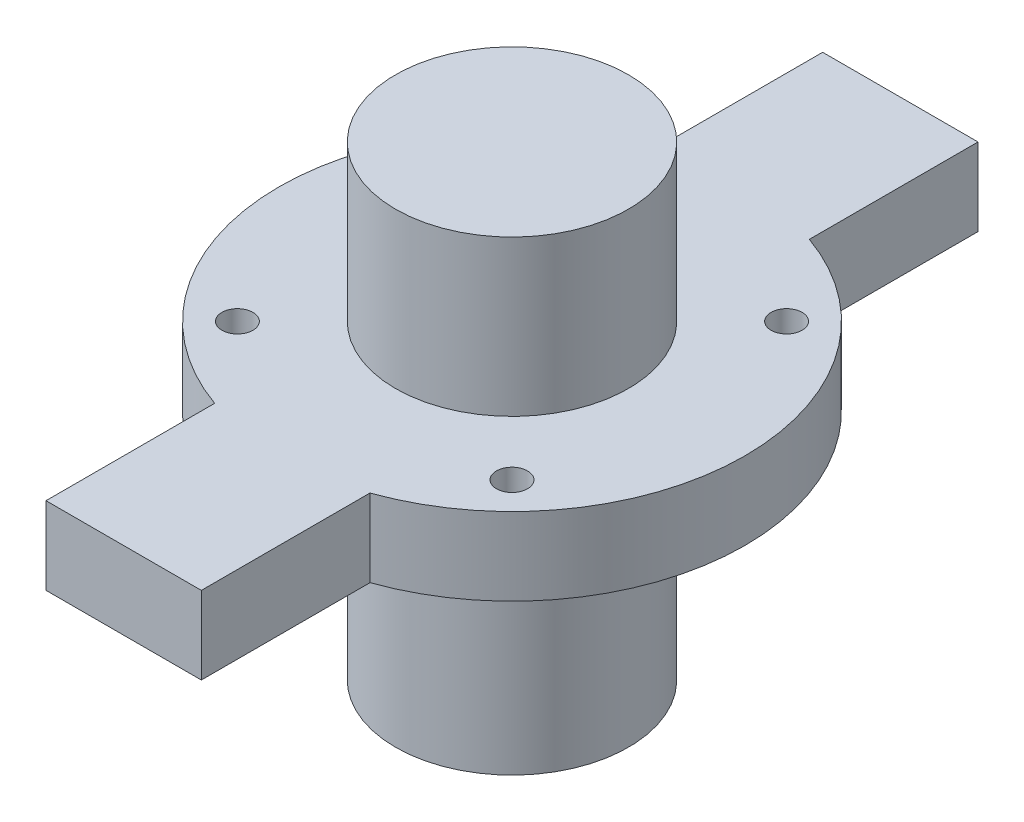
ISO-10303-21;
HEADER;
FILE_DESCRIPTION(('STEP AP214'),'2;1');
FILE_NAME('part.step','',(''),(''),'','','');
FILE_SCHEMA(('AUTOMOTIVE_DESIGN { 1 0 10303 214 1 1 1 1 }'));
ENDSEC;
DATA;
#1=APPLICATION_CONTEXT('core data for automotive mechanical design processes');
#2=APPLICATION_PROTOCOL_DEFINITION('international standard','automotive_design',2000,#1);
#3=PRODUCT_CONTEXT('',#1,'mechanical');
#4=PRODUCT('Part','Part','',(#3));
#5=PRODUCT_RELATED_PRODUCT_CATEGORY('part','',(#4));
#6=PRODUCT_DEFINITION_FORMATION('','',#4);
#7=PRODUCT_DEFINITION_CONTEXT('part definition',#1,'design');
#8=PRODUCT_DEFINITION('design','',#6,#7);
#9=PRODUCT_DEFINITION_SHAPE('','',#8);
#10=(LENGTH_UNIT() NAMED_UNIT(*) SI_UNIT(.MILLI.,.METRE.));
#11=(NAMED_UNIT(*) PLANE_ANGLE_UNIT() SI_UNIT($,.RADIAN.));
#12=(NAMED_UNIT(*) SI_UNIT($,.STERADIAN.) SOLID_ANGLE_UNIT());
#13=UNCERTAINTY_MEASURE_WITH_UNIT(LENGTH_MEASURE(1.E-05),#10,'distance_accuracy_value','');
#14=(GEOMETRIC_REPRESENTATION_CONTEXT(3) GLOBAL_UNCERTAINTY_ASSIGNED_CONTEXT((#13)) GLOBAL_UNIT_ASSIGNED_CONTEXT((#10,
#11,#12)) REPRESENTATION_CONTEXT('',''));
#15=CARTESIAN_POINT('',(0.,0.,0.));
#16=DIRECTION('',(0.,0.,1.));
#17=DIRECTION('',(1.,0.,0.));
#18=AXIS2_PLACEMENT_3D('',#15,#16,#17);
#19=CARTESIAN_POINT('',(0.,10.,0.));
#20=DIRECTION('',(0.,-1.,0.));
#21=DIRECTION('',(0.,0.,-1.));
#22=AXIS2_PLACEMENT_3D('',#19,#20,#21);
#23=CYLINDRICAL_SURFACE('',#22,30.);
#24=DIRECTION('',(0.,-1.,0.));
#25=VECTOR('',#24,1.);
#26=CARTESIAN_POINT('',(-10.,10.,28.2842712474619));
#27=LINE('',#26,#25);
#28=CARTESIAN_POINT('',(-10.,10.,28.2842712474619));
#29=VERTEX_POINT('',#28);
#30=CARTESIAN_POINT('',(-10.,0.,28.2842712474619));
#31=VERTEX_POINT('',#30);
#32=EDGE_CURVE('E120',#29,#31,#27,.T.);
#33=ORIENTED_EDGE('',*,*,#32,.F.);
#34=CARTESIAN_POINT('',(0.,10.,0.));
#35=DIRECTION('',(0.,1.,0.));
#36=DIRECTION('',(0.,0.,1.));
#37=AXIS2_PLACEMENT_3D('',#34,#35,#36);
#38=CIRCLE('',#37,30.);
#39=CARTESIAN_POINT('',(-10.,10.,-28.2842712474619));
#40=VERTEX_POINT('',#39);
#41=EDGE_CURVE('E11',#40,#29,#38,.T.);
#42=ORIENTED_EDGE('',*,*,#41,.F.);
#43=DIRECTION('',(0.,-1.,0.));
#44=VECTOR('',#43,1.);
#45=CARTESIAN_POINT('',(-10.,10.,-28.2842712474619));
#46=LINE('',#45,#44);
#47=CARTESIAN_POINT('',(-10.,0.,-28.2842712474619));
#48=VERTEX_POINT('',#47);
#49=EDGE_CURVE('E165',#48,#40,#46,.F.);
#50=ORIENTED_EDGE('',*,*,#49,.F.);
#51=CARTESIAN_POINT('',(0.,0.,0.));
#52=DIRECTION('',(0.,1.,0.));
#53=DIRECTION('',(0.,0.,1.));
#54=AXIS2_PLACEMENT_3D('',#51,#52,#53);
#55=CIRCLE('',#54,30.);
#56=EDGE_CURVE('E43',#48,#31,#55,.T.);
#57=ORIENTED_EDGE('',*,*,#56,.T.);
#58=EDGE_LOOP('',(#33,#42,#50,#57));
#59=FACE_BOUND('',#58,.T.);
#60=ADVANCED_FACE('F39',(#59),#23,.T.);
#61=CARTESIAN_POINT('',(10.,10.,28.2842712474619));
#62=VERTEX_POINT('',#61);
#63=CARTESIAN_POINT('',(10.,10.,-28.2842712474619));
#64=VERTEX_POINT('',#63);
#65=EDGE_CURVE('E48',#62,#64,#38,.T.);
#66=ORIENTED_EDGE('',*,*,#65,.F.);
#67=DIRECTION('',(0.,-1.,0.));
#68=VECTOR('',#67,1.);
#69=CARTESIAN_POINT('',(10.,10.,28.2842712474619));
#70=LINE('',#69,#68);
#71=CARTESIAN_POINT('',(10.,0.,28.2842712474619));
#72=VERTEX_POINT('',#71);
#73=EDGE_CURVE('E138',#62,#72,#70,.T.);
#74=ORIENTED_EDGE('',*,*,#73,.T.);
#75=CARTESIAN_POINT('',(10.,0.,-28.2842712474619));
#76=VERTEX_POINT('',#75);
#77=EDGE_CURVE('E193',#72,#76,#55,.T.);
#78=ORIENTED_EDGE('',*,*,#77,.T.);
#79=DIRECTION('',(0.,-1.,0.));
#80=VECTOR('',#79,1.);
#81=CARTESIAN_POINT('',(10.,10.,-28.2842712474619));
#82=LINE('',#81,#80);
#83=EDGE_CURVE('E160',#76,#64,#82,.F.);
#84=ORIENTED_EDGE('',*,*,#83,.T.);
#85=EDGE_LOOP('',(#66,#74,#78,#84));
#86=FACE_BOUND('',#85,.T.);
#87=ADVANCED_FACE('F41',(#86),#23,.T.);
#88=CARTESIAN_POINT('',(0.,10.,0.));
#89=DIRECTION('',(0.,1.,0.));
#90=DIRECTION('',(0.,0.,1.));
#91=AXIS2_PLACEMENT_3D('',#88,#89,#90);
#92=PLANE('',#91);
#93=CARTESIAN_POINT('',(0.,10.,0.));
#94=DIRECTION('',(0.,1.,0.));
#95=DIRECTION('',(0.,0.,1.));
#96=AXIS2_PLACEMENT_3D('',#93,#94,#95);
#97=CIRCLE('',#96,15.);
#98=CARTESIAN_POINT('',(0.,10.,15.));
#99=VERTEX_POINT('',#98);
#100=EDGE_CURVE('E189',#99,#99,#97,.T.);
#101=ORIENTED_EDGE('',*,*,#100,.F.);
#102=EDGE_LOOP('',(#101));
#103=FACE_BOUND('',#102,.T.);
#104=ORIENTED_EDGE('',*,*,#41,.T.);
#105=DIRECTION('',(0.,0.,-1.));
#106=VECTOR('',#105,1.);
#107=CARTESIAN_POINT('',(-10.,10.,0.));
#108=LINE('',#107,#106);
#109=CARTESIAN_POINT('',(-10.,10.,50.));
#110=VERTEX_POINT('',#109);
#111=EDGE_CURVE('E133',#110,#29,#108,.T.);
#112=ORIENTED_EDGE('',*,*,#111,.F.);
#113=DIRECTION('',(1.,0.,0.));
#114=VECTOR('',#113,1.);
#115=CARTESIAN_POINT('',(0.,10.,50.));
#116=LINE('',#115,#114);
#117=CARTESIAN_POINT('',(10.,10.,50.));
#118=VERTEX_POINT('',#117);
#119=EDGE_CURVE('E110',#110,#118,#116,.T.);
#120=ORIENTED_EDGE('',*,*,#119,.T.);
#121=DIRECTION('',(0.,0.,-1.));
#122=VECTOR('',#121,1.);
#123=CARTESIAN_POINT('',(10.,10.,0.));
#124=LINE('',#123,#122);
#125=EDGE_CURVE('E55',#118,#62,#124,.T.);
#126=ORIENTED_EDGE('',*,*,#125,.T.);
#127=ORIENTED_EDGE('',*,*,#65,.T.);
#128=DIRECTION('',(0.,0.,-1.));
#129=VECTOR('',#128,1.);
#130=CARTESIAN_POINT('',(10.,10.,0.));
#131=LINE('',#130,#129);
#132=CARTESIAN_POINT('',(10.,10.,-50.));
#133=VERTEX_POINT('',#132);
#134=EDGE_CURVE('E153',#64,#133,#131,.T.);
#135=ORIENTED_EDGE('',*,*,#134,.T.);
#136=DIRECTION('',(1.,0.,0.));
#137=VECTOR('',#136,1.);
#138=CARTESIAN_POINT('',(0.,10.,-50.));
#139=LINE('',#138,#137);
#140=CARTESIAN_POINT('',(-10.,10.,-50.));
#141=VERTEX_POINT('',#140);
#142=EDGE_CURVE('E146',#141,#133,#139,.T.);
#143=ORIENTED_EDGE('',*,*,#142,.F.);
#144=DIRECTION('',(0.,0.,-1.));
#145=VECTOR('',#144,1.);
#146=CARTESIAN_POINT('',(-10.,10.,0.));
#147=LINE('',#146,#145);
#148=EDGE_CURVE('E61',#40,#141,#147,.T.);
#149=ORIENTED_EDGE('',*,*,#148,.F.);
#150=EDGE_LOOP('',(#104,#112,#120,#126,#127,#135,#143,#149));
#151=FACE_BOUND('',#150,.T.);
#152=CARTESIAN_POINT('',(17.6776695296636,10.,17.6776695296638));
#153=DIRECTION('',(0.,1.,0.));
#154=DIRECTION('',(0.,0.,1.));
#155=AXIS2_PLACEMENT_3D('',#152,#153,#154);
#156=CIRCLE('',#155,1.99999999999999);
#157=CARTESIAN_POINT('',(17.6776695296636,10.,19.6776695296638));
#158=VERTEX_POINT('',#157);
#159=EDGE_CURVE('E174',#158,#158,#156,.T.);
#160=ORIENTED_EDGE('',*,*,#159,.F.);
#161=EDGE_LOOP('',(#160));
#162=FACE_BOUND('',#161,.T.);
#163=CARTESIAN_POINT('',(-17.6776695296637,10.,-17.6776695296637));
#164=DIRECTION('',(0.,1.,0.));
#165=DIRECTION('',(0.,0.,1.));
#166=AXIS2_PLACEMENT_3D('',#163,#164,#165);
#167=CIRCLE('',#166,2.);
#168=CARTESIAN_POINT('',(-17.6776695296637,10.,-15.6776695296637));
#169=VERTEX_POINT('',#168);
#170=EDGE_CURVE('E186',#169,#169,#167,.T.);
#171=ORIENTED_EDGE('',*,*,#170,.F.);
#172=EDGE_LOOP('',(#171));
#173=FACE_BOUND('',#172,.T.);
#174=CARTESIAN_POINT('',(17.6776695296637,10.,-17.6776695296637));
#175=DIRECTION('',(0.,1.,0.));
#176=DIRECTION('',(0.,0.,1.));
#177=AXIS2_PLACEMENT_3D('',#174,#175,#176);
#178=CIRCLE('',#177,1.99999999999999);
#179=CARTESIAN_POINT('',(17.6776695296637,10.,-15.6776695296637));
#180=VERTEX_POINT('',#179);
#181=EDGE_CURVE('E180',#180,#180,#178,.T.);
#182=ORIENTED_EDGE('',*,*,#181,.F.);
#183=EDGE_LOOP('',(#182));
#184=FACE_BOUND('',#183,.T.);
#185=CARTESIAN_POINT('',(-17.6776695296638,10.,17.6776695296635));
#186=DIRECTION('',(0.,1.,0.));
#187=DIRECTION('',(0.,0.,1.));
#188=AXIS2_PLACEMENT_3D('',#185,#186,#187);
#189=CIRCLE('',#188,2.);
#190=CARTESIAN_POINT('',(-17.6776695296638,10.,19.6776695296635));
#191=VERTEX_POINT('',#190);
#192=EDGE_CURVE('E168',#191,#191,#189,.T.);
#193=ORIENTED_EDGE('',*,*,#192,.F.);
#194=EDGE_LOOP('',(#193));
#195=FACE_BOUND('',#194,.T.);
#196=ADVANCED_FACE('F202',(#103,#151,#162,#173,#184,#195),#92,.T.);
#197=CARTESIAN_POINT('',(0.,0.,0.));
#198=DIRECTION('',(0.,1.,0.));
#199=DIRECTION('',(0.,0.,1.));
#200=AXIS2_PLACEMENT_3D('',#197,#198,#199);
#201=PLANE('',#200);
#202=CARTESIAN_POINT('',(0.,0.,0.));
#203=DIRECTION('',(0.,1.,0.));
#204=DIRECTION('',(0.,0.,1.));
#205=AXIS2_PLACEMENT_3D('',#202,#203,#204);
#206=CIRCLE('',#205,15.);
#207=CARTESIAN_POINT('',(0.,0.,15.));
#208=VERTEX_POINT('',#207);
#209=EDGE_CURVE('E135',#208,#208,#206,.F.);
#210=ORIENTED_EDGE('',*,*,#209,.F.);
#211=EDGE_LOOP('',(#210));
#212=FACE_BOUND('',#211,.T.);
#213=ORIENTED_EDGE('',*,*,#77,.F.);
#214=DIRECTION('',(0.,0.,-1.));
#215=VECTOR('',#214,1.);
#216=CARTESIAN_POINT('',(10.,0.,0.));
#217=LINE('',#216,#215);
#218=CARTESIAN_POINT('',(10.,0.,50.));
#219=VERTEX_POINT('',#218);
#220=EDGE_CURVE('E114',#219,#72,#217,.T.);
#221=ORIENTED_EDGE('',*,*,#220,.F.);
#222=DIRECTION('',(1.,0.,0.));
#223=VECTOR('',#222,1.);
#224=CARTESIAN_POINT('',(0.,0.,50.));
#225=LINE('',#224,#223);
#226=CARTESIAN_POINT('',(-10.,0.,50.));
#227=VERTEX_POINT('',#226);
#228=EDGE_CURVE('E109',#227,#219,#225,.T.);
#229=ORIENTED_EDGE('',*,*,#228,.F.);
#230=DIRECTION('',(0.,0.,-1.));
#231=VECTOR('',#230,1.);
#232=CARTESIAN_POINT('',(-10.,0.,0.));
#233=LINE('',#232,#231);
#234=EDGE_CURVE('E117',#227,#31,#233,.T.);
#235=ORIENTED_EDGE('',*,*,#234,.T.);
#236=ORIENTED_EDGE('',*,*,#56,.F.);
#237=DIRECTION('',(0.,0.,-1.));
#238=VECTOR('',#237,1.);
#239=CARTESIAN_POINT('',(-10.,0.,0.));
#240=LINE('',#239,#238);
#241=CARTESIAN_POINT('',(-10.,0.,-50.));
#242=VERTEX_POINT('',#241);
#243=EDGE_CURVE('E143',#48,#242,#240,.T.);
#244=ORIENTED_EDGE('',*,*,#243,.T.);
#245=DIRECTION('',(1.,0.,0.));
#246=VECTOR('',#245,1.);
#247=CARTESIAN_POINT('',(0.,0.,-50.));
#248=LINE('',#247,#246);
#249=CARTESIAN_POINT('',(10.,0.,-50.));
#250=VERTEX_POINT('',#249);
#251=EDGE_CURVE('E148',#242,#250,#248,.T.);
#252=ORIENTED_EDGE('',*,*,#251,.T.);
#253=DIRECTION('',(0.,0.,-1.));
#254=VECTOR('',#253,1.);
#255=CARTESIAN_POINT('',(10.,0.,0.));
#256=LINE('',#255,#254);
#257=EDGE_CURVE('E145',#76,#250,#256,.T.);
#258=ORIENTED_EDGE('',*,*,#257,.F.);
#259=EDGE_LOOP('',(#213,#221,#229,#235,#236,#244,#252,#258));
#260=FACE_BOUND('',#259,.T.);
#261=CARTESIAN_POINT('',(-17.6776695296637,0.,-17.6776695296637));
#262=DIRECTION('',(0.,1.,0.));
#263=DIRECTION('',(0.,0.,1.));
#264=AXIS2_PLACEMENT_3D('',#261,#262,#263);
#265=CIRCLE('',#264,2.);
#266=CARTESIAN_POINT('',(-17.6776695296637,0.,-15.6776695296637));
#267=VERTEX_POINT('',#266);
#268=EDGE_CURVE('E183',#267,#267,#265,.T.);
#269=ORIENTED_EDGE('',*,*,#268,.T.);
#270=EDGE_LOOP('',(#269));
#271=FACE_BOUND('',#270,.T.);
#272=CARTESIAN_POINT('',(17.6776695296637,0.,-17.6776695296637));
#273=DIRECTION('',(0.,1.,0.));
#274=DIRECTION('',(0.,0.,1.));
#275=AXIS2_PLACEMENT_3D('',#272,#273,#274);
#276=CIRCLE('',#275,1.99999999999999);
#277=CARTESIAN_POINT('',(17.6776695296637,0.,-15.6776695296637));
#278=VERTEX_POINT('',#277);
#279=EDGE_CURVE('E177',#278,#278,#276,.T.);
#280=ORIENTED_EDGE('',*,*,#279,.T.);
#281=EDGE_LOOP('',(#280));
#282=FACE_BOUND('',#281,.T.);
#283=CARTESIAN_POINT('',(17.6776695296636,0.,17.6776695296638));
#284=DIRECTION('',(0.,1.,0.));
#285=DIRECTION('',(0.,0.,1.));
#286=AXIS2_PLACEMENT_3D('',#283,#284,#285);
#287=CIRCLE('',#286,1.99999999999999);
#288=CARTESIAN_POINT('',(17.6776695296636,0.,19.6776695296638));
#289=VERTEX_POINT('',#288);
#290=EDGE_CURVE('E171',#289,#289,#287,.T.);
#291=ORIENTED_EDGE('',*,*,#290,.T.);
#292=EDGE_LOOP('',(#291));
#293=FACE_BOUND('',#292,.T.);
#294=CARTESIAN_POINT('',(-17.6776695296638,0.,17.6776695296635));
#295=DIRECTION('',(0.,1.,0.));
#296=DIRECTION('',(0.,0.,1.));
#297=AXIS2_PLACEMENT_3D('',#294,#295,#296);
#298=CIRCLE('',#297,2.);
#299=CARTESIAN_POINT('',(-17.6776695296638,0.,19.6776695296635));
#300=VERTEX_POINT('',#299);
#301=EDGE_CURVE('E167',#300,#300,#298,.T.);
#302=ORIENTED_EDGE('',*,*,#301,.T.);
#303=EDGE_LOOP('',(#302));
#304=FACE_BOUND('',#303,.T.);
#305=ADVANCED_FACE('F127',(#212,#260,#271,#282,#293,#304),#201,.F.);
#306=CARTESIAN_POINT('',(-17.6776695296637,10.,-17.6776695296637));
#307=DIRECTION('',(0.,-1.,0.));
#308=DIRECTION('',(0.,0.,-1.));
#309=AXIS2_PLACEMENT_3D('',#306,#307,#308);
#310=CYLINDRICAL_SURFACE('',#309,2.);
#311=ORIENTED_EDGE('',*,*,#170,.T.);
#312=EDGE_LOOP('',(#311));
#313=FACE_BOUND('',#312,.T.);
#314=ORIENTED_EDGE('',*,*,#268,.F.);
#315=EDGE_LOOP('',(#314));
#316=FACE_BOUND('',#315,.T.);
#317=ADVANCED_FACE('F243',(#313,#316),#310,.F.);
#318=CARTESIAN_POINT('',(17.6776695296637,10.,-17.6776695296637));
#319=DIRECTION('',(0.,-1.,0.));
#320=DIRECTION('',(0.,0.,-1.));
#321=AXIS2_PLACEMENT_3D('',#318,#319,#320);
#322=CYLINDRICAL_SURFACE('',#321,1.99999999999999);
#323=ORIENTED_EDGE('',*,*,#181,.T.);
#324=EDGE_LOOP('',(#323));
#325=FACE_BOUND('',#324,.T.);
#326=ORIENTED_EDGE('',*,*,#279,.F.);
#327=EDGE_LOOP('',(#326));
#328=FACE_BOUND('',#327,.T.);
#329=ADVANCED_FACE('F239',(#325,#328),#322,.F.);
#330=CARTESIAN_POINT('',(17.6776695296636,10.,17.6776695296638));
#331=DIRECTION('',(0.,-1.,0.));
#332=DIRECTION('',(0.,0.,-1.));
#333=AXIS2_PLACEMENT_3D('',#330,#331,#332);
#334=CYLINDRICAL_SURFACE('',#333,1.99999999999999);
#335=ORIENTED_EDGE('',*,*,#159,.T.);
#336=EDGE_LOOP('',(#335));
#337=FACE_BOUND('',#336,.T.);
#338=ORIENTED_EDGE('',*,*,#290,.F.);
#339=EDGE_LOOP('',(#338));
#340=FACE_BOUND('',#339,.T.);
#341=ADVANCED_FACE('F232',(#337,#340),#334,.F.);
#342=CARTESIAN_POINT('',(-17.6776695296638,10.,17.6776695296635));
#343=DIRECTION('',(0.,-1.,0.));
#344=DIRECTION('',(0.,0.,-1.));
#345=AXIS2_PLACEMENT_3D('',#342,#343,#344);
#346=CYLINDRICAL_SURFACE('',#345,2.);
#347=ORIENTED_EDGE('',*,*,#192,.T.);
#348=EDGE_LOOP('',(#347));
#349=FACE_BOUND('',#348,.T.);
#350=ORIENTED_EDGE('',*,*,#301,.F.);
#351=EDGE_LOOP('',(#350));
#352=FACE_BOUND('',#351,.T.);
#353=ADVANCED_FACE('F225',(#349,#352),#346,.F.);
#354=CARTESIAN_POINT('',(-10.,0.,0.));
#355=DIRECTION('',(1.,0.,0.));
#356=DIRECTION('',(0.,0.,-1.));
#357=AXIS2_PLACEMENT_3D('',#354,#355,#356);
#358=PLANE('',#357);
#359=ORIENTED_EDGE('',*,*,#243,.F.);
#360=ORIENTED_EDGE('',*,*,#49,.T.);
#361=ORIENTED_EDGE('',*,*,#148,.T.);
#362=DIRECTION('',(0.,1.,0.));
#363=VECTOR('',#362,1.);
#364=CARTESIAN_POINT('',(-10.,0.,-50.));
#365=LINE('',#364,#363);
#366=EDGE_CURVE('E157',#242,#141,#365,.T.);
#367=ORIENTED_EDGE('',*,*,#366,.F.);
#368=EDGE_LOOP('',(#359,#360,#361,#367));
#369=FACE_BOUND('',#368,.T.);
#370=ADVANCED_FACE('F223',(#369),#358,.F.);
#371=CARTESIAN_POINT('',(10.,0.,0.));
#372=DIRECTION('',(1.,0.,0.));
#373=DIRECTION('',(0.,0.,-1.));
#374=AXIS2_PLACEMENT_3D('',#371,#372,#373);
#375=PLANE('',#374);
#376=ORIENTED_EDGE('',*,*,#83,.F.);
#377=ORIENTED_EDGE('',*,*,#257,.T.);
#378=DIRECTION('',(0.,1.,0.));
#379=VECTOR('',#378,1.);
#380=CARTESIAN_POINT('',(10.,0.,-50.));
#381=LINE('',#380,#379);
#382=EDGE_CURVE('E151',#250,#133,#381,.T.);
#383=ORIENTED_EDGE('',*,*,#382,.T.);
#384=ORIENTED_EDGE('',*,*,#134,.F.);
#385=EDGE_LOOP('',(#376,#377,#383,#384));
#386=FACE_BOUND('',#385,.T.);
#387=ADVANCED_FACE('F205',(#386),#375,.T.);
#388=CARTESIAN_POINT('',(0.,0.,-50.));
#389=DIRECTION('',(0.,0.,1.));
#390=DIRECTION('',(1.,0.,0.));
#391=AXIS2_PLACEMENT_3D('',#388,#389,#390);
#392=PLANE('',#391);
#393=ORIENTED_EDGE('',*,*,#142,.T.);
#394=ORIENTED_EDGE('',*,*,#382,.F.);
#395=ORIENTED_EDGE('',*,*,#251,.F.);
#396=ORIENTED_EDGE('',*,*,#366,.T.);
#397=EDGE_LOOP('',(#393,#394,#395,#396));
#398=FACE_BOUND('',#397,.T.);
#399=ADVANCED_FACE('F222',(#398),#392,.F.);
#400=CARTESIAN_POINT('',(-10.,0.,0.));
#401=DIRECTION('',(1.,0.,0.));
#402=DIRECTION('',(0.,0.,-1.));
#403=AXIS2_PLACEMENT_3D('',#400,#401,#402);
#404=PLANE('',#403);
#405=ORIENTED_EDGE('',*,*,#111,.T.);
#406=ORIENTED_EDGE('',*,*,#32,.T.);
#407=ORIENTED_EDGE('',*,*,#234,.F.);
#408=DIRECTION('',(0.,1.,0.));
#409=VECTOR('',#408,1.);
#410=CARTESIAN_POINT('',(-10.,0.,50.));
#411=LINE('',#410,#409);
#412=EDGE_CURVE('E105',#227,#110,#411,.T.);
#413=ORIENTED_EDGE('',*,*,#412,.T.);
#414=EDGE_LOOP('',(#405,#406,#407,#413));
#415=FACE_BOUND('',#414,.T.);
#416=ADVANCED_FACE('F118',(#415),#404,.F.);
#417=CARTESIAN_POINT('',(10.,0.,0.));
#418=DIRECTION('',(1.,0.,0.));
#419=DIRECTION('',(0.,0.,-1.));
#420=AXIS2_PLACEMENT_3D('',#417,#418,#419);
#421=PLANE('',#420);
#422=ORIENTED_EDGE('',*,*,#73,.F.);
#423=ORIENTED_EDGE('',*,*,#125,.F.);
#424=DIRECTION('',(0.,1.,0.));
#425=VECTOR('',#424,1.);
#426=CARTESIAN_POINT('',(10.,0.,50.));
#427=LINE('',#426,#425);
#428=EDGE_CURVE('E113',#219,#118,#427,.T.);
#429=ORIENTED_EDGE('',*,*,#428,.F.);
#430=ORIENTED_EDGE('',*,*,#220,.T.);
#431=EDGE_LOOP('',(#422,#423,#429,#430));
#432=FACE_BOUND('',#431,.T.);
#433=ADVANCED_FACE('F273',(#432),#421,.T.);
#434=CARTESIAN_POINT('',(0.,0.,50.));
#435=DIRECTION('',(0.,0.,1.));
#436=DIRECTION('',(1.,0.,0.));
#437=AXIS2_PLACEMENT_3D('',#434,#435,#436);
#438=PLANE('',#437);
#439=ORIENTED_EDGE('',*,*,#119,.F.);
#440=ORIENTED_EDGE('',*,*,#412,.F.);
#441=ORIENTED_EDGE('',*,*,#228,.T.);
#442=ORIENTED_EDGE('',*,*,#428,.T.);
#443=EDGE_LOOP('',(#439,#440,#441,#442));
#444=FACE_BOUND('',#443,.T.);
#445=ADVANCED_FACE('F107',(#444),#438,.T.);
#446=CARTESIAN_POINT('',(0.,-30.,0.));
#447=DIRECTION('',(0.,1.,0.));
#448=DIRECTION('',(0.,0.,1.));
#449=AXIS2_PLACEMENT_3D('',#446,#447,#448);
#450=PLANE('',#449);
#451=CARTESIAN_POINT('',(0.,-30.,0.));
#452=DIRECTION('',(0.,1.,0.));
#453=DIRECTION('',(0.,0.,1.));
#454=AXIS2_PLACEMENT_3D('',#451,#452,#453);
#455=CIRCLE('',#454,15.);
#456=CARTESIAN_POINT('',(0.,-30.,15.));
#457=VERTEX_POINT('',#456);
#458=EDGE_CURVE('E256',#457,#457,#455,.T.);
#459=ORIENTED_EDGE('',*,*,#458,.F.);
#460=EDGE_LOOP('',(#459));
#461=FACE_BOUND('',#460,.T.);
#462=ADVANCED_FACE('F264',(#461),#450,.F.);
#463=CARTESIAN_POINT('',(0.,30.,0.));
#464=DIRECTION('',(0.,-1.,0.));
#465=DIRECTION('',(0.,0.,-1.));
#466=AXIS2_PLACEMENT_3D('',#463,#464,#465);
#467=CYLINDRICAL_SURFACE('',#466,15.);
#468=ORIENTED_EDGE('',*,*,#458,.T.);
#469=EDGE_LOOP('',(#468));
#470=FACE_BOUND('',#469,.T.);
#471=ORIENTED_EDGE('',*,*,#209,.T.);
#472=EDGE_LOOP('',(#471));
#473=FACE_BOUND('',#472,.T.);
#474=ADVANCED_FACE('F262',(#470,#473),#467,.T.);
#475=ORIENTED_EDGE('',*,*,#100,.T.);
#476=EDGE_LOOP('',(#475));
#477=FACE_BOUND('',#476,.T.);
#478=CARTESIAN_POINT('',(0.,30.,0.));
#479=DIRECTION('',(0.,1.,0.));
#480=DIRECTION('',(0.,0.,1.));
#481=AXIS2_PLACEMENT_3D('',#478,#479,#480);
#482=CIRCLE('',#481,15.);
#483=CARTESIAN_POINT('',(0.,30.,15.));
#484=VERTEX_POINT('',#483);
#485=EDGE_CURVE('E254',#484,#484,#482,.T.);
#486=ORIENTED_EDGE('',*,*,#485,.F.);
#487=EDGE_LOOP('',(#486));
#488=FACE_BOUND('',#487,.T.);
#489=ADVANCED_FACE('F271',(#477,#488),#467,.T.);
#490=CARTESIAN_POINT('',(0.,30.,0.));
#491=DIRECTION('',(0.,1.,0.));
#492=DIRECTION('',(0.,0.,1.));
#493=AXIS2_PLACEMENT_3D('',#490,#491,#492);
#494=PLANE('',#493);
#495=ORIENTED_EDGE('',*,*,#485,.T.);
#496=EDGE_LOOP('',(#495));
#497=FACE_BOUND('',#496,.T.);
#498=ADVANCED_FACE('F276',(#497),#494,.T.);
#499=CLOSED_SHELL('',(#60,#87,#196,#305,#317,#329,#341,#353,#370,#387,#399,#416,#433,#445,#462,
#474,#489,#498));
#500=MANIFOLD_SOLID_BREP('B2',#499);
#501=ADVANCED_BREP_SHAPE_REPRESENTATION('',(#18,#500),#14);
#502=SHAPE_DEFINITION_REPRESENTATION(#9,#501);
ENDSEC;
END-ISO-10303-21;
